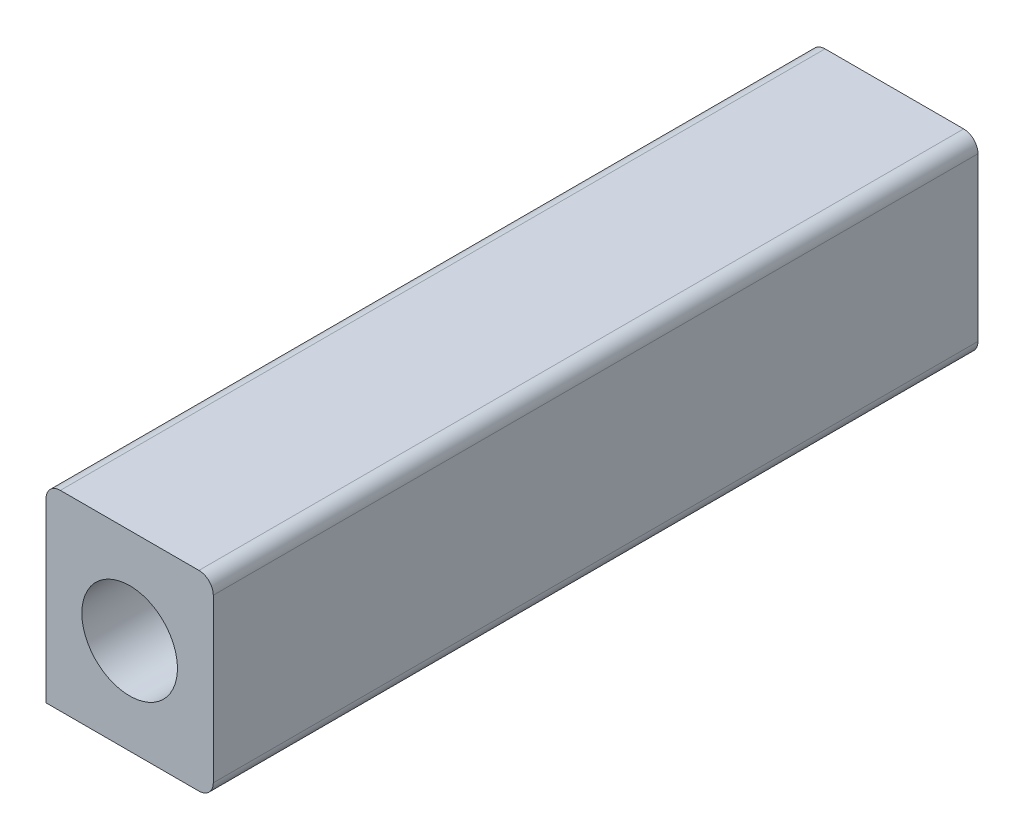
ISO-10303-21;
HEADER;
FILE_DESCRIPTION(('STEP AP214'),'2;1');
FILE_NAME('part.step','',(''),(''),'','','');
FILE_SCHEMA(('AUTOMOTIVE_DESIGN { 1 0 10303 214 1 1 1 1 }'));
ENDSEC;
DATA;
#1=APPLICATION_CONTEXT('core data for automotive mechanical design processes');
#2=APPLICATION_PROTOCOL_DEFINITION('international standard','automotive_design',2000,#1);
#3=PRODUCT_CONTEXT('',#1,'mechanical');
#4=PRODUCT('Part','Part','',(#3));
#5=PRODUCT_RELATED_PRODUCT_CATEGORY('part','',(#4));
#6=PRODUCT_DEFINITION_FORMATION('','',#4);
#7=PRODUCT_DEFINITION_CONTEXT('part definition',#1,'design');
#8=PRODUCT_DEFINITION('design','',#6,#7);
#9=PRODUCT_DEFINITION_SHAPE('','',#8);
#10=(LENGTH_UNIT() NAMED_UNIT(*) SI_UNIT(.MILLI.,.METRE.));
#11=(NAMED_UNIT(*) PLANE_ANGLE_UNIT() SI_UNIT($,.RADIAN.));
#12=(NAMED_UNIT(*) SI_UNIT($,.STERADIAN.) SOLID_ANGLE_UNIT());
#13=UNCERTAINTY_MEASURE_WITH_UNIT(LENGTH_MEASURE(1.E-05),#10,'distance_accuracy_value','');
#14=(GEOMETRIC_REPRESENTATION_CONTEXT(3) GLOBAL_UNCERTAINTY_ASSIGNED_CONTEXT((#13)) GLOBAL_UNIT_ASSIGNED_CONTEXT((#10,
#11,#12)) REPRESENTATION_CONTEXT('',''));
#15=CARTESIAN_POINT('',(0.,0.,0.));
#16=DIRECTION('',(0.,0.,1.));
#17=DIRECTION('',(1.,0.,0.));
#18=AXIS2_PLACEMENT_3D('',#15,#16,#17);
#19=CARTESIAN_POINT('',(-35.,40.,320.));
#20=DIRECTION('',(1.,0.,0.));
#21=DIRECTION('',(0.,0.,-1.));
#22=AXIS2_PLACEMENT_3D('',#19,#20,#21);
#23=PLANE('',#22);
#24=DIRECTION('',(0.,-1.,0.));
#25=VECTOR('',#24,1.);
#26=CARTESIAN_POINT('',(-35.,40.,320.));
#27=LINE('',#26,#25);
#28=CARTESIAN_POINT('',(-35.,34.,320.));
#29=VERTEX_POINT('',#28);
#30=CARTESIAN_POINT('',(-35.,-40.,320.));
#31=VERTEX_POINT('',#30);
#32=EDGE_CURVE('E97',#29,#31,#27,.T.);
#33=ORIENTED_EDGE('',*,*,#32,.F.);
#34=DIRECTION('',(0.,0.,-1.));
#35=VECTOR('',#34,1.);
#36=CARTESIAN_POINT('',(-35.,34.,320.));
#37=LINE('',#36,#35);
#38=CARTESIAN_POINT('',(-35.,34.,0.));
#39=VERTEX_POINT('',#38);
#40=EDGE_CURVE('E144',#29,#39,#37,.T.);
#41=ORIENTED_EDGE('',*,*,#40,.T.);
#42=DIRECTION('',(0.,-1.,0.));
#43=VECTOR('',#42,1.);
#44=CARTESIAN_POINT('',(-35.,40.,0.));
#45=LINE('',#44,#43);
#46=CARTESIAN_POINT('',(-35.,-40.,0.));
#47=VERTEX_POINT('',#46);
#48=EDGE_CURVE('E120',#39,#47,#45,.T.);
#49=ORIENTED_EDGE('',*,*,#48,.T.);
#50=DIRECTION('',(0.,0.,-1.));
#51=VECTOR('',#50,1.);
#52=CARTESIAN_POINT('',(-35.,-40.,320.));
#53=LINE('',#52,#51);
#54=EDGE_CURVE('E114',#31,#47,#53,.T.);
#55=ORIENTED_EDGE('',*,*,#54,.F.);
#56=EDGE_LOOP('',(#33,#41,#49,#55));
#57=FACE_BOUND('',#56,.T.);
#58=ADVANCED_FACE('F39',(#57),#23,.F.);
#59=CARTESIAN_POINT('',(-35.,-40.,320.));
#60=DIRECTION('',(0.,1.,0.));
#61=DIRECTION('',(0.,0.,1.));
#62=AXIS2_PLACEMENT_3D('',#59,#60,#61);
#63=PLANE('',#62);
#64=DIRECTION('',(1.,0.,0.));
#65=VECTOR('',#64,1.);
#66=CARTESIAN_POINT('',(-35.,-40.,0.));
#67=LINE('',#66,#65);
#68=CARTESIAN_POINT('',(29.,-40.,0.));
#69=VERTEX_POINT('',#68);
#70=EDGE_CURVE('E155',#47,#69,#67,.T.);
#71=ORIENTED_EDGE('',*,*,#70,.T.);
#72=DIRECTION('',(0.,0.,-1.));
#73=VECTOR('',#72,1.);
#74=CARTESIAN_POINT('',(29.,-40.,320.));
#75=LINE('',#74,#73);
#76=CARTESIAN_POINT('',(29.,-40.,320.));
#77=VERTEX_POINT('',#76);
#78=EDGE_CURVE('E116',#69,#77,#75,.F.);
#79=ORIENTED_EDGE('',*,*,#78,.T.);
#80=DIRECTION('',(1.,0.,0.));
#81=VECTOR('',#80,1.);
#82=CARTESIAN_POINT('',(-35.,-40.,320.));
#83=LINE('',#82,#81);
#84=EDGE_CURVE('E100',#31,#77,#83,.T.);
#85=ORIENTED_EDGE('',*,*,#84,.F.);
#86=ORIENTED_EDGE('',*,*,#54,.T.);
#87=EDGE_LOOP('',(#71,#79,#85,#86));
#88=FACE_BOUND('',#87,.T.);
#89=ADVANCED_FACE('F113',(#88),#63,.F.);
#90=CARTESIAN_POINT('',(35.,-40.,320.));
#91=DIRECTION('',(-1.,0.,0.));
#92=DIRECTION('',(0.,0.,1.));
#93=AXIS2_PLACEMENT_3D('',#90,#91,#92);
#94=PLANE('',#93);
#95=DIRECTION('',(0.,1.,0.));
#96=VECTOR('',#95,1.);
#97=CARTESIAN_POINT('',(35.,-40.,320.));
#98=LINE('',#97,#96);
#99=CARTESIAN_POINT('',(35.,-34.,320.));
#100=VERTEX_POINT('',#99);
#101=CARTESIAN_POINT('',(35.,34.,320.));
#102=VERTEX_POINT('',#101);
#103=EDGE_CURVE('E117',#100,#102,#98,.T.);
#104=ORIENTED_EDGE('',*,*,#103,.F.);
#105=DIRECTION('',(0.,0.,-1.));
#106=VECTOR('',#105,1.);
#107=CARTESIAN_POINT('',(35.,-34.,320.));
#108=LINE('',#107,#106);
#109=CARTESIAN_POINT('',(35.,-34.,0.));
#110=VERTEX_POINT('',#109);
#111=EDGE_CURVE('E125',#100,#110,#108,.T.);
#112=ORIENTED_EDGE('',*,*,#111,.T.);
#113=DIRECTION('',(0.,1.,0.));
#114=VECTOR('',#113,1.);
#115=CARTESIAN_POINT('',(35.,-40.,0.));
#116=LINE('',#115,#114);
#117=CARTESIAN_POINT('',(35.,34.,0.));
#118=VERTEX_POINT('',#117);
#119=EDGE_CURVE('E154',#110,#118,#116,.T.);
#120=ORIENTED_EDGE('',*,*,#119,.T.);
#121=DIRECTION('',(0.,0.,-1.));
#122=VECTOR('',#121,1.);
#123=CARTESIAN_POINT('',(35.,34.,320.));
#124=LINE('',#123,#122);
#125=EDGE_CURVE('E122',#118,#102,#124,.F.);
#126=ORIENTED_EDGE('',*,*,#125,.T.);
#127=EDGE_LOOP('',(#104,#112,#120,#126));
#128=FACE_BOUND('',#127,.T.);
#129=ADVANCED_FACE('F190',(#128),#94,.F.);
#130=CARTESIAN_POINT('',(35.,40.,320.));
#131=DIRECTION('',(0.,-1.,0.));
#132=DIRECTION('',(0.,0.,-1.));
#133=AXIS2_PLACEMENT_3D('',#130,#131,#132);
#134=PLANE('',#133);
#135=DIRECTION('',(-1.,0.,0.));
#136=VECTOR('',#135,1.);
#137=CARTESIAN_POINT('',(35.,40.,0.));
#138=LINE('',#137,#136);
#139=CARTESIAN_POINT('',(29.,40.,0.));
#140=VERTEX_POINT('',#139);
#141=CARTESIAN_POINT('',(-29.,40.,0.));
#142=VERTEX_POINT('',#141);
#143=EDGE_CURVE('E108',#140,#142,#138,.T.);
#144=ORIENTED_EDGE('',*,*,#143,.T.);
#145=DIRECTION('',(0.,0.,-1.));
#146=VECTOR('',#145,1.);
#147=CARTESIAN_POINT('',(-29.,40.,320.));
#148=LINE('',#147,#146);
#149=CARTESIAN_POINT('',(-29.,40.,320.));
#150=VERTEX_POINT('',#149);
#151=EDGE_CURVE('E11',#142,#150,#148,.F.);
#152=ORIENTED_EDGE('',*,*,#151,.T.);
#153=DIRECTION('',(-1.,0.,0.));
#154=VECTOR('',#153,1.);
#155=CARTESIAN_POINT('',(35.,40.,320.));
#156=LINE('',#155,#154);
#157=CARTESIAN_POINT('',(29.,40.,320.));
#158=VERTEX_POINT('',#157);
#159=EDGE_CURVE('E123',#158,#150,#156,.T.);
#160=ORIENTED_EDGE('',*,*,#159,.F.);
#161=DIRECTION('',(0.,0.,-1.));
#162=VECTOR('',#161,1.);
#163=CARTESIAN_POINT('',(29.,40.,320.));
#164=LINE('',#163,#162);
#165=EDGE_CURVE('E47',#158,#140,#164,.T.);
#166=ORIENTED_EDGE('',*,*,#165,.T.);
#167=EDGE_LOOP('',(#144,#152,#160,#166));
#168=FACE_BOUND('',#167,.T.);
#169=ADVANCED_FACE('F148',(#168),#134,.F.);
#170=CARTESIAN_POINT('',(0.,0.,320.));
#171=DIRECTION('',(0.,0.,1.));
#172=DIRECTION('',(1.,0.,0.));
#173=AXIS2_PLACEMENT_3D('',#170,#171,#172);
#174=PLANE('',#173);
#175=CARTESIAN_POINT('',(0.,0.,320.));
#176=DIRECTION('',(0.,0.,-1.));
#177=DIRECTION('',(-1.,0.,0.));
#178=AXIS2_PLACEMENT_3D('',#175,#176,#177);
#179=CIRCLE('',#178,20.);
#180=CARTESIAN_POINT('',(-20.,0.,320.));
#181=VERTEX_POINT('',#180);
#182=EDGE_CURVE('E160',#181,#181,#179,.T.);
#183=ORIENTED_EDGE('',*,*,#182,.T.);
#184=EDGE_LOOP('',(#183));
#185=FACE_BOUND('',#184,.T.);
#186=ORIENTED_EDGE('',*,*,#84,.T.);
#187=CARTESIAN_POINT('',(29.,-34.,320.));
#188=DIRECTION('',(0.,0.,1.));
#189=DIRECTION('',(1.,0.,0.));
#190=AXIS2_PLACEMENT_3D('',#187,#188,#189);
#191=CIRCLE('',#190,6.);
#192=EDGE_CURVE('E142',#77,#100,#191,.T.);
#193=ORIENTED_EDGE('',*,*,#192,.T.);
#194=ORIENTED_EDGE('',*,*,#103,.T.);
#195=CARTESIAN_POINT('',(29.,34.,320.));
#196=DIRECTION('',(0.,0.,1.));
#197=DIRECTION('',(1.,0.,0.));
#198=AXIS2_PLACEMENT_3D('',#195,#196,#197);
#199=CIRCLE('',#198,6.);
#200=EDGE_CURVE('E59',#102,#158,#199,.T.);
#201=ORIENTED_EDGE('',*,*,#200,.T.);
#202=ORIENTED_EDGE('',*,*,#159,.T.);
#203=CARTESIAN_POINT('',(-29.,34.,320.));
#204=DIRECTION('',(0.,0.,1.));
#205=DIRECTION('',(1.,0.,0.));
#206=AXIS2_PLACEMENT_3D('',#203,#204,#205);
#207=CIRCLE('',#206,6.);
#208=EDGE_CURVE('E103',#150,#29,#207,.T.);
#209=ORIENTED_EDGE('',*,*,#208,.T.);
#210=ORIENTED_EDGE('',*,*,#32,.T.);
#211=EDGE_LOOP('',(#186,#193,#194,#201,#202,#209,#210));
#212=FACE_BOUND('',#211,.T.);
#213=ADVANCED_FACE('F99',(#185,#212),#174,.T.);
#214=CARTESIAN_POINT('',(0.,0.,0.));
#215=DIRECTION('',(0.,0.,1.));
#216=DIRECTION('',(1.,0.,0.));
#217=AXIS2_PLACEMENT_3D('',#214,#215,#216);
#218=PLANE('',#217);
#219=CARTESIAN_POINT('',(0.,0.,0.));
#220=DIRECTION('',(0.,0.,-1.));
#221=DIRECTION('',(-1.,0.,0.));
#222=AXIS2_PLACEMENT_3D('',#219,#220,#221);
#223=CIRCLE('',#222,20.);
#224=CARTESIAN_POINT('',(-20.,0.,0.));
#225=VERTEX_POINT('',#224);
#226=EDGE_CURVE('E163',#225,#225,#223,.T.);
#227=ORIENTED_EDGE('',*,*,#226,.F.);
#228=EDGE_LOOP('',(#227));
#229=FACE_BOUND('',#228,.T.);
#230=ORIENTED_EDGE('',*,*,#119,.F.);
#231=CARTESIAN_POINT('',(29.,-34.,0.));
#232=DIRECTION('',(0.,0.,1.));
#233=DIRECTION('',(1.,0.,0.));
#234=AXIS2_PLACEMENT_3D('',#231,#232,#233);
#235=CIRCLE('',#234,6.);
#236=EDGE_CURVE('E137',#110,#69,#235,.F.);
#237=ORIENTED_EDGE('',*,*,#236,.T.);
#238=ORIENTED_EDGE('',*,*,#70,.F.);
#239=ORIENTED_EDGE('',*,*,#48,.F.);
#240=CARTESIAN_POINT('',(-29.,34.,0.));
#241=DIRECTION('',(0.,0.,1.));
#242=DIRECTION('',(1.,0.,0.));
#243=AXIS2_PLACEMENT_3D('',#240,#241,#242);
#244=CIRCLE('',#243,6.);
#245=EDGE_CURVE('E135',#39,#142,#244,.F.);
#246=ORIENTED_EDGE('',*,*,#245,.T.);
#247=ORIENTED_EDGE('',*,*,#143,.F.);
#248=CARTESIAN_POINT('',(29.,34.,0.));
#249=DIRECTION('',(0.,0.,1.));
#250=DIRECTION('',(1.,0.,0.));
#251=AXIS2_PLACEMENT_3D('',#248,#249,#250);
#252=CIRCLE('',#251,6.);
#253=EDGE_CURVE('E133',#140,#118,#252,.F.);
#254=ORIENTED_EDGE('',*,*,#253,.T.);
#255=EDGE_LOOP('',(#230,#237,#238,#239,#246,#247,#254));
#256=FACE_BOUND('',#255,.T.);
#257=ADVANCED_FACE('F152',(#229,#256),#218,.F.);
#258=CARTESIAN_POINT('',(0.,0.,320.));
#259=DIRECTION('',(0.,0.,-1.));
#260=DIRECTION('',(-1.,0.,0.));
#261=AXIS2_PLACEMENT_3D('',#258,#259,#260);
#262=CYLINDRICAL_SURFACE('',#261,20.);
#263=ORIENTED_EDGE('',*,*,#182,.F.);
#264=EDGE_LOOP('',(#263));
#265=FACE_BOUND('',#264,.T.);
#266=ORIENTED_EDGE('',*,*,#226,.T.);
#267=EDGE_LOOP('',(#266));
#268=FACE_BOUND('',#267,.T.);
#269=ADVANCED_FACE('F170',(#265,#268),#262,.F.);
#270=CARTESIAN_POINT('',(29.,-34.,320.));
#271=DIRECTION('',(0.,0.,-1.));
#272=DIRECTION('',(-1.,0.,0.));
#273=AXIS2_PLACEMENT_3D('',#270,#271,#272);
#274=CYLINDRICAL_SURFACE('',#273,6.);
#275=ORIENTED_EDGE('',*,*,#192,.F.);
#276=ORIENTED_EDGE('',*,*,#78,.F.);
#277=ORIENTED_EDGE('',*,*,#236,.F.);
#278=ORIENTED_EDGE('',*,*,#111,.F.);
#279=EDGE_LOOP('',(#275,#276,#277,#278));
#280=FACE_BOUND('',#279,.T.);
#281=ADVANCED_FACE('F173',(#280),#274,.T.);
#282=CARTESIAN_POINT('',(-29.,34.,320.));
#283=DIRECTION('',(0.,0.,-1.));
#284=DIRECTION('',(-1.,0.,0.));
#285=AXIS2_PLACEMENT_3D('',#282,#283,#284);
#286=CYLINDRICAL_SURFACE('',#285,6.);
#287=ORIENTED_EDGE('',*,*,#208,.F.);
#288=ORIENTED_EDGE('',*,*,#151,.F.);
#289=ORIENTED_EDGE('',*,*,#245,.F.);
#290=ORIENTED_EDGE('',*,*,#40,.F.);
#291=EDGE_LOOP('',(#287,#288,#289,#290));
#292=FACE_BOUND('',#291,.T.);
#293=ADVANCED_FACE('F194',(#292),#286,.T.);
#294=CARTESIAN_POINT('',(29.,34.,320.));
#295=DIRECTION('',(0.,0.,-1.));
#296=DIRECTION('',(-1.,0.,0.));
#297=AXIS2_PLACEMENT_3D('',#294,#295,#296);
#298=CYLINDRICAL_SURFACE('',#297,6.);
#299=ORIENTED_EDGE('',*,*,#200,.F.);
#300=ORIENTED_EDGE('',*,*,#125,.F.);
#301=ORIENTED_EDGE('',*,*,#253,.F.);
#302=ORIENTED_EDGE('',*,*,#165,.F.);
#303=EDGE_LOOP('',(#299,#300,#301,#302));
#304=FACE_BOUND('',#303,.T.);
#305=ADVANCED_FACE('F41',(#304),#298,.T.);
#306=CLOSED_SHELL('',(#58,#89,#129,#169,#213,#257,#269,#281,#293,#305));
#307=MANIFOLD_SOLID_BREP('B2',#306);
#308=ADVANCED_BREP_SHAPE_REPRESENTATION('',(#18,#307),#14);
#309=SHAPE_DEFINITION_REPRESENTATION(#9,#308);
ENDSEC;
END-ISO-10303-21;
